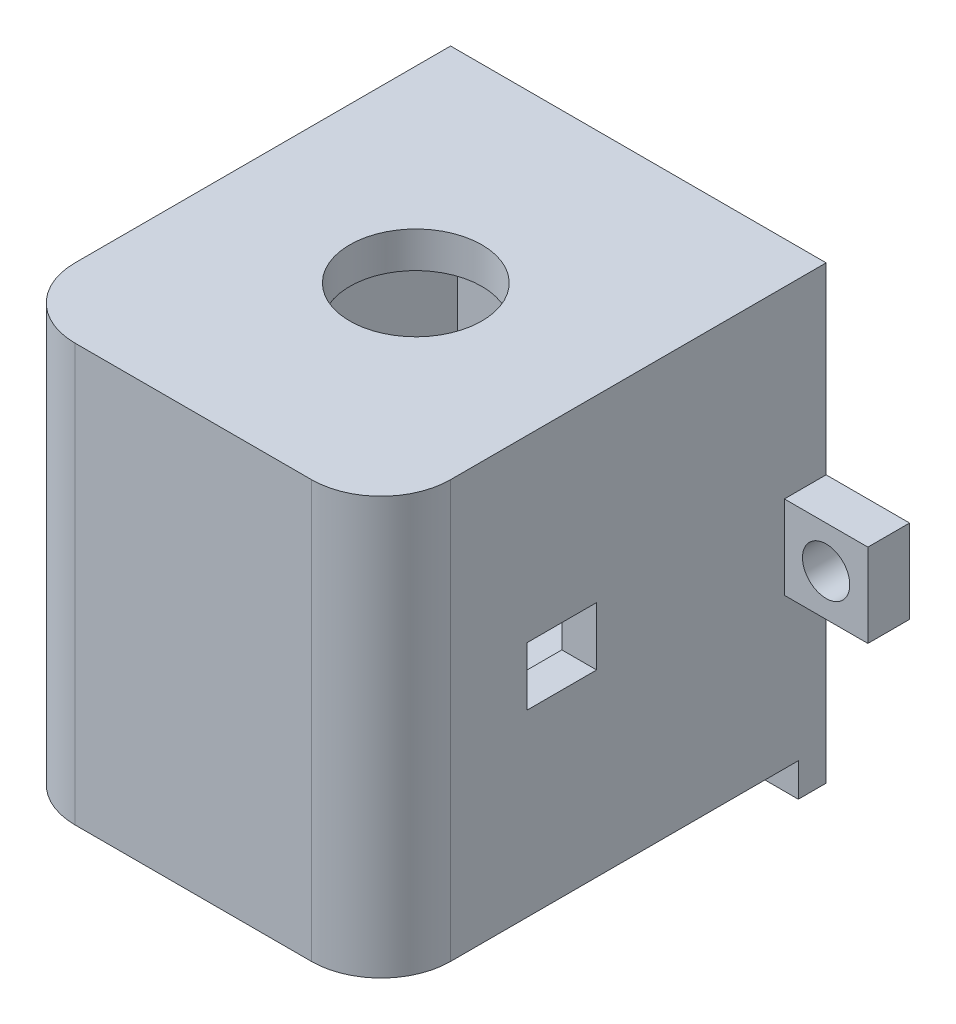
ISO-10303-21;
HEADER;
FILE_DESCRIPTION(('STEP AP214'),'2;1');
FILE_NAME('part.step','',(''),(''),'','','');
FILE_SCHEMA(('AUTOMOTIVE_DESIGN { 1 0 10303 214 1 1 1 1 }'));
ENDSEC;
DATA;
#1=APPLICATION_CONTEXT('core data for automotive mechanical design processes');
#2=APPLICATION_PROTOCOL_DEFINITION('international standard','automotive_design',2000,#1);
#3=PRODUCT_CONTEXT('',#1,'mechanical');
#4=PRODUCT('Part','Part','',(#3));
#5=PRODUCT_RELATED_PRODUCT_CATEGORY('part','',(#4));
#6=PRODUCT_DEFINITION_FORMATION('','',#4);
#7=PRODUCT_DEFINITION_CONTEXT('part definition',#1,'design');
#8=PRODUCT_DEFINITION('design','',#6,#7);
#9=PRODUCT_DEFINITION_SHAPE('','',#8);
#10=(LENGTH_UNIT() NAMED_UNIT(*) SI_UNIT(.MILLI.,.METRE.));
#11=(NAMED_UNIT(*) PLANE_ANGLE_UNIT() SI_UNIT($,.RADIAN.));
#12=(NAMED_UNIT(*) SI_UNIT($,.STERADIAN.) SOLID_ANGLE_UNIT());
#13=UNCERTAINTY_MEASURE_WITH_UNIT(LENGTH_MEASURE(1.E-05),#10,'distance_accuracy_value','');
#14=(GEOMETRIC_REPRESENTATION_CONTEXT(3) GLOBAL_UNCERTAINTY_ASSIGNED_CONTEXT((#13)) GLOBAL_UNIT_ASSIGNED_CONTEXT((#10,
#11,#12)) REPRESENTATION_CONTEXT('',''));
#15=CARTESIAN_POINT('',(0.,0.,0.));
#16=DIRECTION('',(0.,0.,1.));
#17=DIRECTION('',(1.,0.,0.));
#18=AXIS2_PLACEMENT_3D('',#15,#16,#17);
#19=CARTESIAN_POINT('',(-13.5,-13.8,28.));
#20=DIRECTION('',(1.,0.,0.));
#21=DIRECTION('',(0.,0.,-1.));
#22=AXIS2_PLACEMENT_3D('',#19,#20,#21);
#23=PLANE('',#22);
#24=CARTESIAN_POINT('',(-13.5,1.19999999999999,17.));
#25=DIRECTION('',(1.,0.,0.));
#26=DIRECTION('',(0.,0.,-1.));
#27=AXIS2_PLACEMENT_3D('',#24,#25,#26);
#28=CIRCLE('',#27,2.5);
#29=CARTESIAN_POINT('',(-13.5,1.19999999999999,14.5));
#30=VERTEX_POINT('',#29);
#31=EDGE_CURVE('E345',#30,#30,#28,.T.);
#32=ORIENTED_EDGE('',*,*,#31,.T.);
#33=EDGE_LOOP('',(#32));
#34=FACE_BOUND('',#33,.T.);
#35=DIRECTION('',(0.,0.,-1.));
#36=VECTOR('',#35,1.);
#37=CARTESIAN_POINT('',(-13.5,-13.8,28.));
#38=LINE('',#37,#36);
#39=CARTESIAN_POINT('',(-13.5,-13.8,25.));
#40=VERTEX_POINT('',#39);
#41=CARTESIAN_POINT('',(-13.5,-13.8,0.));
#42=VERTEX_POINT('',#41);
#43=EDGE_CURVE('E390',#40,#42,#38,.T.);
#44=ORIENTED_EDGE('',*,*,#43,.F.);
#45=DIRECTION('',(0.,-1.,0.));
#46=VECTOR('',#45,1.);
#47=CARTESIAN_POINT('',(-13.5,16.2,25.));
#48=LINE('',#47,#46);
#49=CARTESIAN_POINT('',(-13.5,16.2,25.));
#50=VERTEX_POINT('',#49);
#51=EDGE_CURVE('E11',#40,#50,#48,.F.);
#52=ORIENTED_EDGE('',*,*,#51,.T.);
#53=DIRECTION('',(0.,0.,-1.));
#54=VECTOR('',#53,1.);
#55=CARTESIAN_POINT('',(-13.5,16.2,28.));
#56=LINE('',#55,#54);
#57=CARTESIAN_POINT('',(-13.5,16.2,-2.));
#58=VERTEX_POINT('',#57);
#59=EDGE_CURVE('E384',#50,#58,#56,.T.);
#60=ORIENTED_EDGE('',*,*,#59,.T.);
#61=DIRECTION('',(0.,1.,0.));
#62=VECTOR('',#61,1.);
#63=CARTESIAN_POINT('',(-13.5,-16.2,-2.));
#64=LINE('',#63,#62);
#65=CARTESIAN_POINT('',(-13.5,3.,-2.));
#66=VERTEX_POINT('',#65);
#67=EDGE_CURVE('E287',#66,#58,#64,.T.);
#68=ORIENTED_EDGE('',*,*,#67,.F.);
#69=DIRECTION('',(0.,0.,-1.));
#70=VECTOR('',#69,1.);
#71=CARTESIAN_POINT('',(-13.5,3.,1.));
#72=LINE('',#71,#70);
#73=CARTESIAN_POINT('',(-13.5,3.,1.));
#74=VERTEX_POINT('',#73);
#75=EDGE_CURVE('E225',#74,#66,#72,.T.);
#76=ORIENTED_EDGE('',*,*,#75,.F.);
#77=DIRECTION('',(0.,1.,0.));
#78=VECTOR('',#77,1.);
#79=CARTESIAN_POINT('',(-13.5,-3.,1.));
#80=LINE('',#79,#78);
#81=CARTESIAN_POINT('',(-13.5,-3.,1.));
#82=VERTEX_POINT('',#81);
#83=EDGE_CURVE('E204',#82,#74,#80,.T.);
#84=ORIENTED_EDGE('',*,*,#83,.F.);
#85=DIRECTION('',(0.,0.,-1.));
#86=VECTOR('',#85,1.);
#87=CARTESIAN_POINT('',(-13.5,-3.,1.));
#88=LINE('',#87,#86);
#89=CARTESIAN_POINT('',(-13.5,-3.,-2.));
#90=VERTEX_POINT('',#89);
#91=EDGE_CURVE('E213',#82,#90,#88,.T.);
#92=ORIENTED_EDGE('',*,*,#91,.T.);
#93=CARTESIAN_POINT('',(-13.5,-16.2,-2.));
#94=VERTEX_POINT('',#93);
#95=EDGE_CURVE('E288',#94,#90,#64,.T.);
#96=ORIENTED_EDGE('',*,*,#95,.F.);
#97=DIRECTION('',(0.,0.,1.));
#98=VECTOR('',#97,1.);
#99=CARTESIAN_POINT('',(-13.5,-16.2,-2.));
#100=LINE('',#99,#98);
#101=CARTESIAN_POINT('',(-13.5,-16.2,0.));
#102=VERTEX_POINT('',#101);
#103=EDGE_CURVE('E293',#94,#102,#100,.T.);
#104=ORIENTED_EDGE('',*,*,#103,.T.);
#105=DIRECTION('',(0.,1.,0.));
#106=VECTOR('',#105,1.);
#107=CARTESIAN_POINT('',(-13.5,-16.2,0.));
#108=LINE('',#107,#106);
#109=EDGE_CURVE('E297',#102,#42,#108,.T.);
#110=ORIENTED_EDGE('',*,*,#109,.T.);
#111=EDGE_LOOP('',(#44,#52,#60,#68,#76,#84,#92,#96,#104,#110));
#112=FACE_BOUND('',#111,.T.);
#113=ADVANCED_FACE('F39',(#34,#112),#23,.F.);
#114=CARTESIAN_POINT('',(13.5,-13.8,28.));
#115=DIRECTION('',(-1.,0.,0.));
#116=DIRECTION('',(0.,0.,1.));
#117=AXIS2_PLACEMENT_3D('',#114,#115,#116);
#118=PLANE('',#117);
#119=DIRECTION('',(0.,0.,1.));
#120=VECTOR('',#119,1.);
#121=CARTESIAN_POINT('',(13.5,-0.900000000000007,28.));
#122=LINE('',#121,#120);
#123=CARTESIAN_POINT('',(13.5,-0.900000000000004,14.5));
#124=VERTEX_POINT('',#123);
#125=CARTESIAN_POINT('',(13.5,-0.900000000000006,19.5));
#126=VERTEX_POINT('',#125);
#127=EDGE_CURVE('E325',#124,#126,#122,.T.);
#128=ORIENTED_EDGE('',*,*,#127,.T.);
#129=DIRECTION('',(0.,1.,0.));
#130=VECTOR('',#129,1.);
#131=CARTESIAN_POINT('',(13.5,-13.8,19.5));
#132=LINE('',#131,#130);
#133=CARTESIAN_POINT('',(13.5,3.3,19.5));
#134=VERTEX_POINT('',#133);
#135=EDGE_CURVE('E341',#126,#134,#132,.T.);
#136=ORIENTED_EDGE('',*,*,#135,.T.);
#137=DIRECTION('',(0.,0.,-1.));
#138=VECTOR('',#137,1.);
#139=CARTESIAN_POINT('',(13.5,3.29999999999999,28.));
#140=LINE('',#139,#138);
#141=CARTESIAN_POINT('',(13.5,3.3,14.5));
#142=VERTEX_POINT('',#141);
#143=EDGE_CURVE('E338',#134,#142,#140,.T.);
#144=ORIENTED_EDGE('',*,*,#143,.T.);
#145=DIRECTION('',(0.,-1.,0.));
#146=VECTOR('',#145,1.);
#147=CARTESIAN_POINT('',(13.5,-13.8,14.5));
#148=LINE('',#147,#146);
#149=EDGE_CURVE('E335',#142,#124,#148,.T.);
#150=ORIENTED_EDGE('',*,*,#149,.T.);
#151=EDGE_LOOP('',(#128,#136,#144,#150));
#152=FACE_BOUND('',#151,.T.);
#153=DIRECTION('',(0.,0.,-1.));
#154=VECTOR('',#153,1.);
#155=CARTESIAN_POINT('',(13.5,16.2,28.));
#156=LINE('',#155,#154);
#157=CARTESIAN_POINT('',(13.5,16.2,25.));
#158=VERTEX_POINT('',#157);
#159=CARTESIAN_POINT('',(13.5,16.2,-2.));
#160=VERTEX_POINT('',#159);
#161=EDGE_CURVE('E386',#158,#160,#156,.T.);
#162=ORIENTED_EDGE('',*,*,#161,.F.);
#163=DIRECTION('',(0.,1.,0.));
#164=VECTOR('',#163,1.);
#165=CARTESIAN_POINT('',(13.5,-13.8,25.));
#166=LINE('',#165,#164);
#167=CARTESIAN_POINT('',(13.5,-13.8,25.));
#168=VERTEX_POINT('',#167);
#169=EDGE_CURVE('E62',#158,#168,#166,.F.);
#170=ORIENTED_EDGE('',*,*,#169,.T.);
#171=DIRECTION('',(0.,0.,-1.));
#172=VECTOR('',#171,1.);
#173=CARTESIAN_POINT('',(13.5,-13.8,28.));
#174=LINE('',#173,#172);
#175=CARTESIAN_POINT('',(13.5,-13.8,0.));
#176=VERTEX_POINT('',#175);
#177=EDGE_CURVE('E388',#168,#176,#174,.T.);
#178=ORIENTED_EDGE('',*,*,#177,.T.);
#179=DIRECTION('',(0.,-1.,0.));
#180=VECTOR('',#179,1.);
#181=CARTESIAN_POINT('',(13.5,-16.2,0.));
#182=LINE('',#181,#180);
#183=CARTESIAN_POINT('',(13.5,-16.2,0.));
#184=VERTEX_POINT('',#183);
#185=EDGE_CURVE('E274',#176,#184,#182,.T.);
#186=ORIENTED_EDGE('',*,*,#185,.T.);
#187=DIRECTION('',(0.,0.,1.));
#188=VECTOR('',#187,1.);
#189=CARTESIAN_POINT('',(13.5,-16.2,-2.));
#190=LINE('',#189,#188);
#191=CARTESIAN_POINT('',(13.5,-16.2,-2.));
#192=VERTEX_POINT('',#191);
#193=EDGE_CURVE('E302',#192,#184,#190,.T.);
#194=ORIENTED_EDGE('',*,*,#193,.F.);
#195=DIRECTION('',(0.,-1.,0.));
#196=VECTOR('',#195,1.);
#197=CARTESIAN_POINT('',(13.5,-16.2,-2.));
#198=LINE('',#197,#196);
#199=CARTESIAN_POINT('',(13.5,-3.,-2.));
#200=VERTEX_POINT('',#199);
#201=EDGE_CURVE('E285',#200,#192,#198,.T.);
#202=ORIENTED_EDGE('',*,*,#201,.F.);
#203=DIRECTION('',(0.,0.,-1.));
#204=VECTOR('',#203,1.);
#205=CARTESIAN_POINT('',(13.5,-3.,1.));
#206=LINE('',#205,#204);
#207=CARTESIAN_POINT('',(13.5,-3.,1.));
#208=VERTEX_POINT('',#207);
#209=EDGE_CURVE('E272',#208,#200,#206,.T.);
#210=ORIENTED_EDGE('',*,*,#209,.F.);
#211=DIRECTION('',(0.,1.,0.));
#212=VECTOR('',#211,1.);
#213=CARTESIAN_POINT('',(13.5,-3.,1.));
#214=LINE('',#213,#212);
#215=CARTESIAN_POINT('',(13.5,3.,1.));
#216=VERTEX_POINT('',#215);
#217=EDGE_CURVE('E251',#208,#216,#214,.T.);
#218=ORIENTED_EDGE('',*,*,#217,.T.);
#219=DIRECTION('',(0.,0.,-1.));
#220=VECTOR('',#219,1.);
#221=CARTESIAN_POINT('',(13.5,3.,1.));
#222=LINE('',#221,#220);
#223=CARTESIAN_POINT('',(13.5,3.,-2.));
#224=VERTEX_POINT('',#223);
#225=EDGE_CURVE('E264',#216,#224,#222,.T.);
#226=ORIENTED_EDGE('',*,*,#225,.T.);
#227=EDGE_CURVE('E281',#160,#224,#198,.T.);
#228=ORIENTED_EDGE('',*,*,#227,.F.);
#229=EDGE_LOOP('',(#162,#170,#178,#186,#194,#202,#210,#218,#226,#228));
#230=FACE_BOUND('',#229,.T.);
#231=ADVANCED_FACE('F429',(#152,#230),#118,.F.);
#232=CARTESIAN_POINT('',(13.5,-13.8,28.));
#233=DIRECTION('',(0.,1.,0.));
#234=DIRECTION('',(-1.,0.,0.));
#235=AXIS2_PLACEMENT_3D('',#232,#233,#234);
#236=PLANE('',#235);
#237=CARTESIAN_POINT('',(0.,-13.8,14.));
#238=DIRECTION('',(0.,-1.,0.));
#239=DIRECTION('',(0.,0.,-1.));
#240=AXIS2_PLACEMENT_3D('',#237,#238,#239);
#241=CIRCLE('',#240,4.75);
#242=CARTESIAN_POINT('',(0.,-13.8,9.25));
#243=VERTEX_POINT('',#242);
#244=EDGE_CURVE('E311',#243,#243,#241,.T.);
#245=ORIENTED_EDGE('',*,*,#244,.F.);
#246=EDGE_LOOP('',(#245));
#247=FACE_BOUND('',#246,.T.);
#248=ORIENTED_EDGE('',*,*,#177,.F.);
#249=CARTESIAN_POINT('',(8.5,-13.8,25.));
#250=DIRECTION('',(0.,1.,0.));
#251=DIRECTION('',(-1.,0.,0.));
#252=AXIS2_PLACEMENT_3D('',#249,#250,#251);
#253=CIRCLE('',#252,5.);
#254=CARTESIAN_POINT('',(8.5,-13.8,30.));
#255=VERTEX_POINT('',#254);
#256=EDGE_CURVE('E47',#168,#255,#253,.F.);
#257=ORIENTED_EDGE('',*,*,#256,.T.);
#258=DIRECTION('',(1.,0.,0.));
#259=VECTOR('',#258,1.);
#260=CARTESIAN_POINT('',(13.5,-13.8,30.));
#261=LINE('',#260,#259);
#262=CARTESIAN_POINT('',(-8.49999999999999,-13.8,30.));
#263=VERTEX_POINT('',#262);
#264=EDGE_CURVE('E305',#263,#255,#261,.T.);
#265=ORIENTED_EDGE('',*,*,#264,.F.);
#266=CARTESIAN_POINT('',(-8.5,-13.8,25.));
#267=DIRECTION('',(0.,1.,0.));
#268=DIRECTION('',(-1.,0.,0.));
#269=AXIS2_PLACEMENT_3D('',#266,#267,#268);
#270=CIRCLE('',#269,5.);
#271=EDGE_CURVE('E54',#263,#40,#270,.F.);
#272=ORIENTED_EDGE('',*,*,#271,.T.);
#273=ORIENTED_EDGE('',*,*,#43,.T.);
#274=DIRECTION('',(1.,0.,0.));
#275=VECTOR('',#274,1.);
#276=CARTESIAN_POINT('',(13.5,-13.8,0.));
#277=LINE('',#276,#275);
#278=EDGE_CURVE('E381',#42,#176,#277,.T.);
#279=ORIENTED_EDGE('',*,*,#278,.T.);
#280=EDGE_LOOP('',(#248,#257,#265,#272,#273,#279));
#281=FACE_BOUND('',#280,.T.);
#282=ADVANCED_FACE('F417',(#247,#281),#236,.F.);
#283=CARTESIAN_POINT('',(13.5,16.2,28.));
#284=DIRECTION('',(0.,-1.,0.));
#285=DIRECTION('',(0.,0.,-1.));
#286=AXIS2_PLACEMENT_3D('',#283,#284,#285);
#287=PLANE('',#286);
#288=CARTESIAN_POINT('',(0.,16.2,14.));
#289=DIRECTION('',(0.,-1.,0.));
#290=DIRECTION('',(0.,0.,-1.));
#291=AXIS2_PLACEMENT_3D('',#288,#289,#290);
#292=CIRCLE('',#291,4.75);
#293=CARTESIAN_POINT('',(0.,16.2,9.25));
#294=VERTEX_POINT('',#293);
#295=EDGE_CURVE('E318',#294,#294,#292,.T.);
#296=ORIENTED_EDGE('',*,*,#295,.T.);
#297=EDGE_LOOP('',(#296));
#298=FACE_BOUND('',#297,.T.);
#299=DIRECTION('',(-1.,0.,0.));
#300=VECTOR('',#299,1.);
#301=CARTESIAN_POINT('',(13.5,16.2,30.));
#302=LINE('',#301,#300);
#303=CARTESIAN_POINT('',(8.5,16.2,30.));
#304=VERTEX_POINT('',#303);
#305=CARTESIAN_POINT('',(-8.49999999999999,16.2,30.));
#306=VERTEX_POINT('',#305);
#307=EDGE_CURVE('E308',#304,#306,#302,.T.);
#308=ORIENTED_EDGE('',*,*,#307,.F.);
#309=CARTESIAN_POINT('',(8.5,16.2,25.));
#310=DIRECTION('',(0.,-1.,0.));
#311=DIRECTION('',(0.,0.,-1.));
#312=AXIS2_PLACEMENT_3D('',#309,#310,#311);
#313=CIRCLE('',#312,5.);
#314=EDGE_CURVE('E413',#304,#158,#313,.F.);
#315=ORIENTED_EDGE('',*,*,#314,.T.);
#316=ORIENTED_EDGE('',*,*,#161,.T.);
#317=DIRECTION('',(1.,0.,0.));
#318=VECTOR('',#317,1.);
#319=CARTESIAN_POINT('',(-13.5,16.2,-2.));
#320=LINE('',#319,#318);
#321=EDGE_CURVE('E290',#58,#160,#320,.T.);
#322=ORIENTED_EDGE('',*,*,#321,.F.);
#323=ORIENTED_EDGE('',*,*,#59,.F.);
#324=CARTESIAN_POINT('',(-8.5,16.2,25.));
#325=DIRECTION('',(0.,-1.,0.));
#326=DIRECTION('',(0.,0.,-1.));
#327=AXIS2_PLACEMENT_3D('',#324,#325,#326);
#328=CIRCLE('',#327,5.);
#329=EDGE_CURVE('E411',#50,#306,#328,.F.);
#330=ORIENTED_EDGE('',*,*,#329,.T.);
#331=EDGE_LOOP('',(#308,#315,#316,#322,#323,#330));
#332=FACE_BOUND('',#331,.T.);
#333=ADVANCED_FACE('F426',(#298,#332),#287,.F.);
#334=CARTESIAN_POINT('',(-11.,-11.3914969736936,28.));
#335=DIRECTION('',(1.,0.,0.));
#336=DIRECTION('',(0.,0.,-1.));
#337=AXIS2_PLACEMENT_3D('',#334,#335,#336);
#338=PLANE('',#337);
#339=CARTESIAN_POINT('',(-11.,1.19999999999999,17.));
#340=DIRECTION('',(1.,0.,0.));
#341=DIRECTION('',(0.,0.,-1.));
#342=AXIS2_PLACEMENT_3D('',#339,#340,#341);
#343=CIRCLE('',#342,2.5);
#344=CARTESIAN_POINT('',(-11.,1.19999999999999,14.5));
#345=VERTEX_POINT('',#344);
#346=EDGE_CURVE('E344',#345,#345,#343,.T.);
#347=ORIENTED_EDGE('',*,*,#346,.F.);
#348=EDGE_LOOP('',(#347));
#349=FACE_BOUND('',#348,.T.);
#350=DIRECTION('',(0.,-1.,0.));
#351=VECTOR('',#350,1.);
#352=CARTESIAN_POINT('',(-11.,-11.3914969736936,0.));
#353=LINE('',#352,#351);
#354=CARTESIAN_POINT('',(-11.,13.6085030263064,0.));
#355=VERTEX_POINT('',#354);
#356=CARTESIAN_POINT('',(-11.,-11.3914969736936,0.));
#357=VERTEX_POINT('',#356);
#358=EDGE_CURVE('E348',#355,#357,#353,.T.);
#359=ORIENTED_EDGE('',*,*,#358,.F.);
#360=DIRECTION('',(0.,0.,-1.));
#361=VECTOR('',#360,1.);
#362=CARTESIAN_POINT('',(-11.,13.6085030263064,28.));
#363=LINE('',#362,#361);
#364=CARTESIAN_POINT('',(-11.,13.6085030263064,28.));
#365=VERTEX_POINT('',#364);
#366=EDGE_CURVE('E362',#365,#355,#363,.T.);
#367=ORIENTED_EDGE('',*,*,#366,.F.);
#368=DIRECTION('',(0.,-1.,0.));
#369=VECTOR('',#368,1.);
#370=CARTESIAN_POINT('',(-11.,-11.3914969736936,28.));
#371=LINE('',#370,#369);
#372=CARTESIAN_POINT('',(-11.,-11.3914969736936,28.));
#373=VERTEX_POINT('',#372);
#374=EDGE_CURVE('E349',#365,#373,#371,.T.);
#375=ORIENTED_EDGE('',*,*,#374,.T.);
#376=DIRECTION('',(0.,0.,-1.));
#377=VECTOR('',#376,1.);
#378=CARTESIAN_POINT('',(-11.,-11.3914969736936,28.));
#379=LINE('',#378,#377);
#380=EDGE_CURVE('E378',#373,#357,#379,.T.);
#381=ORIENTED_EDGE('',*,*,#380,.T.);
#382=EDGE_LOOP('',(#359,#367,#375,#381));
#383=FACE_BOUND('',#382,.T.);
#384=ADVANCED_FACE('F571',(#349,#383),#338,.T.);
#385=CARTESIAN_POINT('',(11.,-11.3914969736936,28.));
#386=DIRECTION('',(0.,1.,0.));
#387=DIRECTION('',(-1.,0.,0.));
#388=AXIS2_PLACEMENT_3D('',#385,#386,#387);
#389=PLANE('',#388);
#390=CARTESIAN_POINT('',(0.,-11.3914969736936,14.));
#391=DIRECTION('',(0.,1.,0.));
#392=DIRECTION('',(-1.,0.,0.));
#393=AXIS2_PLACEMENT_3D('',#390,#391,#392);
#394=CIRCLE('',#393,4.75);
#395=CARTESIAN_POINT('',(-4.74999999999999,-11.3914969736936,14.));
#396=VERTEX_POINT('',#395);
#397=EDGE_CURVE('E315',#396,#396,#394,.T.);
#398=ORIENTED_EDGE('',*,*,#397,.F.);
#399=EDGE_LOOP('',(#398));
#400=FACE_BOUND('',#399,.T.);
#401=DIRECTION('',(1.,0.,0.));
#402=VECTOR('',#401,1.);
#403=CARTESIAN_POINT('',(11.,-11.3914969736936,0.));
#404=LINE('',#403,#402);
#405=CARTESIAN_POINT('',(11.,-11.3914969736936,0.));
#406=VERTEX_POINT('',#405);
#407=EDGE_CURVE('E365',#357,#406,#404,.T.);
#408=ORIENTED_EDGE('',*,*,#407,.F.);
#409=ORIENTED_EDGE('',*,*,#380,.F.);
#410=DIRECTION('',(1.,0.,0.));
#411=VECTOR('',#410,1.);
#412=CARTESIAN_POINT('',(11.,-11.3914969736936,28.));
#413=LINE('',#412,#411);
#414=CARTESIAN_POINT('',(11.,-11.3914969736936,28.));
#415=VERTEX_POINT('',#414);
#416=EDGE_CURVE('E352',#373,#415,#413,.T.);
#417=ORIENTED_EDGE('',*,*,#416,.T.);
#418=DIRECTION('',(0.,0.,-1.));
#419=VECTOR('',#418,1.);
#420=CARTESIAN_POINT('',(11.,-11.3914969736936,28.));
#421=LINE('',#420,#419);
#422=EDGE_CURVE('E376',#415,#406,#421,.T.);
#423=ORIENTED_EDGE('',*,*,#422,.T.);
#424=EDGE_LOOP('',(#408,#409,#417,#423));
#425=FACE_BOUND('',#424,.T.);
#426=ADVANCED_FACE('F567',(#400,#425),#389,.T.);
#427=CARTESIAN_POINT('',(11.,-11.3914969736936,28.));
#428=DIRECTION('',(-1.,0.,0.));
#429=DIRECTION('',(0.,0.,1.));
#430=AXIS2_PLACEMENT_3D('',#427,#428,#429);
#431=PLANE('',#430);
#432=DIRECTION('',(0.,1.,0.));
#433=VECTOR('',#432,1.);
#434=CARTESIAN_POINT('',(11.,-11.3914969736936,19.5));
#435=LINE('',#434,#433);
#436=CARTESIAN_POINT('',(11.,-0.900000000000005,19.5));
#437=VERTEX_POINT('',#436);
#438=CARTESIAN_POINT('',(11.,3.3,19.5));
#439=VERTEX_POINT('',#438);
#440=EDGE_CURVE('E401',#437,#439,#435,.T.);
#441=ORIENTED_EDGE('',*,*,#440,.F.);
#442=DIRECTION('',(0.,0.,1.));
#443=VECTOR('',#442,1.);
#444=CARTESIAN_POINT('',(11.,-0.900000000000007,28.));
#445=LINE('',#444,#443);
#446=CARTESIAN_POINT('',(11.,-0.900000000000005,14.5));
#447=VERTEX_POINT('',#446);
#448=EDGE_CURVE('E392',#447,#437,#445,.T.);
#449=ORIENTED_EDGE('',*,*,#448,.F.);
#450=DIRECTION('',(0.,-1.,0.));
#451=VECTOR('',#450,1.);
#452=CARTESIAN_POINT('',(11.,-11.3914969736936,14.5));
#453=LINE('',#452,#451);
#454=CARTESIAN_POINT('',(11.,3.3,14.5));
#455=VERTEX_POINT('',#454);
#456=EDGE_CURVE('E396',#455,#447,#453,.T.);
#457=ORIENTED_EDGE('',*,*,#456,.F.);
#458=DIRECTION('',(0.,0.,-1.));
#459=VECTOR('',#458,1.);
#460=CARTESIAN_POINT('',(11.,3.3,28.));
#461=LINE('',#460,#459);
#462=EDGE_CURVE('E399',#439,#455,#461,.T.);
#463=ORIENTED_EDGE('',*,*,#462,.F.);
#464=EDGE_LOOP('',(#441,#449,#457,#463));
#465=FACE_BOUND('',#464,.T.);
#466=DIRECTION('',(0.,1.,0.));
#467=VECTOR('',#466,1.);
#468=CARTESIAN_POINT('',(11.,-11.3914969736936,0.));
#469=LINE('',#468,#467);
#470=CARTESIAN_POINT('',(11.,13.6085030263064,0.));
#471=VERTEX_POINT('',#470);
#472=EDGE_CURVE('E368',#406,#471,#469,.T.);
#473=ORIENTED_EDGE('',*,*,#472,.F.);
#474=ORIENTED_EDGE('',*,*,#422,.F.);
#475=DIRECTION('',(0.,1.,0.));
#476=VECTOR('',#475,1.);
#477=CARTESIAN_POINT('',(11.,-11.3914969736936,28.));
#478=LINE('',#477,#476);
#479=CARTESIAN_POINT('',(11.,13.6085030263064,28.));
#480=VERTEX_POINT('',#479);
#481=EDGE_CURVE('E356',#415,#480,#478,.T.);
#482=ORIENTED_EDGE('',*,*,#481,.T.);
#483=DIRECTION('',(0.,0.,-1.));
#484=VECTOR('',#483,1.);
#485=CARTESIAN_POINT('',(11.,13.6085030263064,28.));
#486=LINE('',#485,#484);
#487=EDGE_CURVE('E374',#480,#471,#486,.T.);
#488=ORIENTED_EDGE('',*,*,#487,.T.);
#489=EDGE_LOOP('',(#473,#474,#482,#488));
#490=FACE_BOUND('',#489,.T.);
#491=ADVANCED_FACE('F563',(#465,#490),#431,.T.);
#492=CARTESIAN_POINT('',(11.,13.6085030263064,28.));
#493=DIRECTION('',(0.,-1.,0.));
#494=DIRECTION('',(1.,0.,0.));
#495=AXIS2_PLACEMENT_3D('',#492,#493,#494);
#496=PLANE('',#495);
#497=CARTESIAN_POINT('',(0.,13.6085030263064,14.));
#498=DIRECTION('',(0.,-1.,0.));
#499=DIRECTION('',(1.,0.,0.));
#500=AXIS2_PLACEMENT_3D('',#497,#498,#499);
#501=CIRCLE('',#500,4.75);
#502=CARTESIAN_POINT('',(4.75000000000001,13.6085030263064,14.));
#503=VERTEX_POINT('',#502);
#504=EDGE_CURVE('E314',#503,#503,#501,.T.);
#505=ORIENTED_EDGE('',*,*,#504,.F.);
#506=EDGE_LOOP('',(#505));
#507=FACE_BOUND('',#506,.T.);
#508=DIRECTION('',(-1.,0.,0.));
#509=VECTOR('',#508,1.);
#510=CARTESIAN_POINT('',(11.,13.6085030263064,0.));
#511=LINE('',#510,#509);
#512=EDGE_CURVE('E353',#471,#355,#511,.T.);
#513=ORIENTED_EDGE('',*,*,#512,.F.);
#514=ORIENTED_EDGE('',*,*,#487,.F.);
#515=DIRECTION('',(-1.,0.,0.));
#516=VECTOR('',#515,1.);
#517=CARTESIAN_POINT('',(11.,13.6085030263064,28.));
#518=LINE('',#517,#516);
#519=EDGE_CURVE('E359',#480,#365,#518,.T.);
#520=ORIENTED_EDGE('',*,*,#519,.T.);
#521=ORIENTED_EDGE('',*,*,#366,.T.);
#522=EDGE_LOOP('',(#513,#514,#520,#521));
#523=FACE_BOUND('',#522,.T.);
#524=ADVANCED_FACE('F559',(#507,#523),#496,.T.);
#525=CARTESIAN_POINT('',(0.500000000000004,1.19999999999999,17.));
#526=DIRECTION('',(-1.,0.,0.));
#527=DIRECTION('',(0.,0.,1.));
#528=AXIS2_PLACEMENT_3D('',#525,#526,#527);
#529=CYLINDRICAL_SURFACE('',#528,2.5);
#530=ORIENTED_EDGE('',*,*,#346,.T.);
#531=EDGE_LOOP('',(#530));
#532=FACE_BOUND('',#531,.T.);
#533=ORIENTED_EDGE('',*,*,#31,.F.);
#534=EDGE_LOOP('',(#533));
#535=FACE_BOUND('',#534,.T.);
#536=ADVANCED_FACE('F555',(#532,#535),#529,.F.);
#537=CARTESIAN_POINT('',(-0.499999999999997,-0.900000000000005,19.5));
#538=DIRECTION('',(0.,0.,1.));
#539=DIRECTION('',(1.,0.,0.));
#540=AXIS2_PLACEMENT_3D('',#537,#538,#539);
#541=PLANE('',#540);
#542=DIRECTION('',(1.,0.,0.));
#543=VECTOR('',#542,1.);
#544=CARTESIAN_POINT('',(-0.499999999999997,-0.900000000000005,19.5));
#545=LINE('',#544,#543);
#546=EDGE_CURVE('E321',#437,#126,#545,.T.);
#547=ORIENTED_EDGE('',*,*,#546,.F.);
#548=ORIENTED_EDGE('',*,*,#440,.T.);
#549=DIRECTION('',(1.,0.,0.));
#550=VECTOR('',#549,1.);
#551=CARTESIAN_POINT('',(-0.499999999999997,3.3,19.5));
#552=LINE('',#551,#550);
#553=EDGE_CURVE('E322',#439,#134,#552,.T.);
#554=ORIENTED_EDGE('',*,*,#553,.T.);
#555=ORIENTED_EDGE('',*,*,#135,.F.);
#556=EDGE_LOOP('',(#547,#548,#554,#555));
#557=FACE_BOUND('',#556,.T.);
#558=ADVANCED_FACE('F545',(#557),#541,.F.);
#559=CARTESIAN_POINT('',(-0.499999999999997,3.3,14.5));
#560=DIRECTION('',(0.,1.,0.));
#561=DIRECTION('',(0.,0.,1.));
#562=AXIS2_PLACEMENT_3D('',#559,#560,#561);
#563=PLANE('',#562);
#564=ORIENTED_EDGE('',*,*,#553,.F.);
#565=ORIENTED_EDGE('',*,*,#462,.T.);
#566=DIRECTION('',(1.,0.,0.));
#567=VECTOR('',#566,1.);
#568=CARTESIAN_POINT('',(-0.499999999999997,3.3,14.5));
#569=LINE('',#568,#567);
#570=EDGE_CURVE('E326',#455,#142,#569,.T.);
#571=ORIENTED_EDGE('',*,*,#570,.T.);
#572=ORIENTED_EDGE('',*,*,#143,.F.);
#573=EDGE_LOOP('',(#564,#565,#571,#572));
#574=FACE_BOUND('',#573,.T.);
#575=ADVANCED_FACE('F541',(#574),#563,.F.);
#576=CARTESIAN_POINT('',(-0.499999999999997,-0.900000000000004,14.5));
#577=DIRECTION('',(0.,0.,-1.));
#578=DIRECTION('',(-1.,0.,0.));
#579=AXIS2_PLACEMENT_3D('',#576,#577,#578);
#580=PLANE('',#579);
#581=ORIENTED_EDGE('',*,*,#570,.F.);
#582=ORIENTED_EDGE('',*,*,#456,.T.);
#583=DIRECTION('',(1.,0.,0.));
#584=VECTOR('',#583,1.);
#585=CARTESIAN_POINT('',(-0.499999999999997,-0.900000000000004,14.5));
#586=LINE('',#585,#584);
#587=EDGE_CURVE('E329',#447,#124,#586,.T.);
#588=ORIENTED_EDGE('',*,*,#587,.T.);
#589=ORIENTED_EDGE('',*,*,#149,.F.);
#590=EDGE_LOOP('',(#581,#582,#588,#589));
#591=FACE_BOUND('',#590,.T.);
#592=ADVANCED_FACE('F544',(#591),#580,.F.);
#593=CARTESIAN_POINT('',(-0.499999999999997,-0.900000000000004,14.5));
#594=DIRECTION('',(0.,-1.,0.));
#595=DIRECTION('',(0.,0.,-1.));
#596=AXIS2_PLACEMENT_3D('',#593,#594,#595);
#597=PLANE('',#596);
#598=ORIENTED_EDGE('',*,*,#587,.F.);
#599=ORIENTED_EDGE('',*,*,#448,.T.);
#600=ORIENTED_EDGE('',*,*,#546,.T.);
#601=ORIENTED_EDGE('',*,*,#127,.F.);
#602=EDGE_LOOP('',(#598,#599,#600,#601));
#603=FACE_BOUND('',#602,.T.);
#604=ADVANCED_FACE('F539',(#603),#597,.F.);
#605=CARTESIAN_POINT('',(0.,44.2,14.));
#606=DIRECTION('',(0.,-1.,0.));
#607=DIRECTION('',(0.,0.,-1.));
#608=AXIS2_PLACEMENT_3D('',#605,#606,#607);
#609=CYLINDRICAL_SURFACE('',#608,4.75);
#610=ORIENTED_EDGE('',*,*,#504,.T.);
#611=EDGE_LOOP('',(#610));
#612=FACE_BOUND('',#611,.T.);
#613=ORIENTED_EDGE('',*,*,#295,.F.);
#614=EDGE_LOOP('',(#613));
#615=FACE_BOUND('',#614,.T.);
#616=ADVANCED_FACE('F536',(#612,#615),#609,.F.);
#617=ORIENTED_EDGE('',*,*,#397,.T.);
#618=EDGE_LOOP('',(#617));
#619=FACE_BOUND('',#618,.T.);
#620=ORIENTED_EDGE('',*,*,#244,.T.);
#621=EDGE_LOOP('',(#620));
#622=FACE_BOUND('',#621,.T.);
#623=ADVANCED_FACE('F534',(#619,#622),#609,.F.);
#624=CARTESIAN_POINT('',(0.,0.,28.));
#625=DIRECTION('',(0.,0.,1.));
#626=DIRECTION('',(1.,0.,0.));
#627=AXIS2_PLACEMENT_3D('',#624,#625,#626);
#628=PLANE('',#627);
#629=ORIENTED_EDGE('',*,*,#416,.F.);
#630=ORIENTED_EDGE('',*,*,#374,.F.);
#631=ORIENTED_EDGE('',*,*,#519,.F.);
#632=ORIENTED_EDGE('',*,*,#481,.F.);
#633=EDGE_LOOP('',(#629,#630,#631,#632));
#634=FACE_BOUND('',#633,.T.);
#635=ADVANCED_FACE('F531',(#634),#628,.F.);
#636=CARTESIAN_POINT('',(0.,0.,30.));
#637=DIRECTION('',(0.,0.,1.));
#638=DIRECTION('',(1.,0.,0.));
#639=AXIS2_PLACEMENT_3D('',#636,#637,#638);
#640=PLANE('',#639);
#641=ORIENTED_EDGE('',*,*,#264,.T.);
#642=DIRECTION('',(0.,1.,0.));
#643=VECTOR('',#642,1.);
#644=CARTESIAN_POINT('',(8.5,16.2,30.));
#645=LINE('',#644,#643);
#646=EDGE_CURVE('E408',#255,#304,#645,.T.);
#647=ORIENTED_EDGE('',*,*,#646,.T.);
#648=ORIENTED_EDGE('',*,*,#307,.T.);
#649=DIRECTION('',(0.,-1.,0.));
#650=VECTOR('',#649,1.);
#651=CARTESIAN_POINT('',(-8.5,-13.8,30.));
#652=LINE('',#651,#650);
#653=EDGE_CURVE('E403',#306,#263,#652,.T.);
#654=ORIENTED_EDGE('',*,*,#653,.T.);
#655=EDGE_LOOP('',(#641,#647,#648,#654));
#656=FACE_BOUND('',#655,.T.);
#657=ADVANCED_FACE('F421',(#656),#640,.T.);
#658=CARTESIAN_POINT('',(0.,0.,0.));
#659=DIRECTION('',(0.,0.,-1.));
#660=DIRECTION('',(-1.,0.,0.));
#661=AXIS2_PLACEMENT_3D('',#658,#659,#660);
#662=PLANE('',#661);
#663=ORIENTED_EDGE('',*,*,#512,.T.);
#664=ORIENTED_EDGE('',*,*,#358,.T.);
#665=ORIENTED_EDGE('',*,*,#407,.T.);
#666=ORIENTED_EDGE('',*,*,#472,.T.);
#667=EDGE_LOOP('',(#663,#664,#665,#666));
#668=FACE_BOUND('',#667,.T.);
#669=ADVANCED_FACE('F526',(#668),#662,.F.);
#670=CARTESIAN_POINT('',(-13.5,-16.2,-2.));
#671=DIRECTION('',(0.,1.,0.));
#672=DIRECTION('',(0.,0.,1.));
#673=AXIS2_PLACEMENT_3D('',#670,#671,#672);
#674=PLANE('',#673);
#675=DIRECTION('',(-1.,0.,0.));
#676=VECTOR('',#675,1.);
#677=CARTESIAN_POINT('',(-13.5,-16.2,0.));
#678=LINE('',#677,#676);
#679=EDGE_CURVE('E295',#184,#102,#678,.T.);
#680=ORIENTED_EDGE('',*,*,#679,.T.);
#681=ORIENTED_EDGE('',*,*,#103,.F.);
#682=DIRECTION('',(-1.,0.,0.));
#683=VECTOR('',#682,1.);
#684=CARTESIAN_POINT('',(-13.5,-16.2,-2.));
#685=LINE('',#684,#683);
#686=EDGE_CURVE('E284',#192,#94,#685,.T.);
#687=ORIENTED_EDGE('',*,*,#686,.F.);
#688=ORIENTED_EDGE('',*,*,#193,.T.);
#689=EDGE_LOOP('',(#680,#681,#687,#688));
#690=FACE_BOUND('',#689,.T.);
#691=ADVANCED_FACE('F450',(#690),#674,.F.);
#692=CARTESIAN_POINT('',(0.,0.,-2.));
#693=DIRECTION('',(0.,0.,-1.));
#694=DIRECTION('',(-1.,0.,0.));
#695=AXIS2_PLACEMENT_3D('',#692,#693,#694);
#696=PLANE('',#695);
#697=DIRECTION('',(-1.,0.,0.));
#698=VECTOR('',#697,1.);
#699=CARTESIAN_POINT('',(-13.5,3.,-2.));
#700=LINE('',#699,#698);
#701=CARTESIAN_POINT('',(-19.5,3.,-2.));
#702=VERTEX_POINT('',#701);
#703=EDGE_CURVE('E226',#66,#702,#700,.T.);
#704=ORIENTED_EDGE('',*,*,#703,.F.);
#705=ORIENTED_EDGE('',*,*,#67,.T.);
#706=ORIENTED_EDGE('',*,*,#321,.T.);
#707=ORIENTED_EDGE('',*,*,#227,.T.);
#708=DIRECTION('',(1.,0.,0.));
#709=VECTOR('',#708,1.);
#710=CARTESIAN_POINT('',(13.5,3.,-2.));
#711=LINE('',#710,#709);
#712=CARTESIAN_POINT('',(19.5,3.,-2.));
#713=VERTEX_POINT('',#712);
#714=EDGE_CURVE('E248',#224,#713,#711,.T.);
#715=ORIENTED_EDGE('',*,*,#714,.T.);
#716=DIRECTION('',(0.,-1.,0.));
#717=VECTOR('',#716,1.);
#718=CARTESIAN_POINT('',(19.5,3.,-2.));
#719=LINE('',#718,#717);
#720=CARTESIAN_POINT('',(19.5,-3.,-2.));
#721=VERTEX_POINT('',#720);
#722=EDGE_CURVE('E267',#713,#721,#719,.T.);
#723=ORIENTED_EDGE('',*,*,#722,.T.);
#724=DIRECTION('',(-1.,0.,0.));
#725=VECTOR('',#724,1.);
#726=CARTESIAN_POINT('',(19.5,-3.,-2.));
#727=LINE('',#726,#725);
#728=EDGE_CURVE('E255',#721,#200,#727,.T.);
#729=ORIENTED_EDGE('',*,*,#728,.T.);
#730=ORIENTED_EDGE('',*,*,#201,.T.);
#731=ORIENTED_EDGE('',*,*,#686,.T.);
#732=ORIENTED_EDGE('',*,*,#95,.T.);
#733=DIRECTION('',(1.,0.,0.));
#734=VECTOR('',#733,1.);
#735=CARTESIAN_POINT('',(-19.5,-3.,-2.));
#736=LINE('',#735,#734);
#737=CARTESIAN_POINT('',(-19.5,-3.,-2.));
#738=VERTEX_POINT('',#737);
#739=EDGE_CURVE('E216',#738,#90,#736,.T.);
#740=ORIENTED_EDGE('',*,*,#739,.F.);
#741=DIRECTION('',(0.,-1.,0.));
#742=VECTOR('',#741,1.);
#743=CARTESIAN_POINT('',(-19.5,3.,-2.));
#744=LINE('',#743,#742);
#745=EDGE_CURVE('E228',#702,#738,#744,.T.);
#746=ORIENTED_EDGE('',*,*,#745,.F.);
#747=EDGE_LOOP('',(#704,#705,#706,#707,#715,#723,#729,#730,#731,#732,#740,#746));
#748=FACE_BOUND('',#747,.T.);
#749=CARTESIAN_POINT('',(-16.5,0.,-2.));
#750=DIRECTION('',(0.,0.,1.));
#751=DIRECTION('',(1.,0.,0.));
#752=AXIS2_PLACEMENT_3D('',#749,#750,#751);
#753=CIRCLE('',#752,1.7);
#754=CARTESIAN_POINT('',(-14.8,0.,-2.));
#755=VERTEX_POINT('',#754);
#756=EDGE_CURVE('E231',#755,#755,#753,.T.);
#757=ORIENTED_EDGE('',*,*,#756,.T.);
#758=EDGE_LOOP('',(#757));
#759=FACE_BOUND('',#758,.T.);
#760=CARTESIAN_POINT('',(16.5,0.,-2.));
#761=DIRECTION('',(0.,0.,-1.));
#762=DIRECTION('',(-1.,0.,0.));
#763=AXIS2_PLACEMENT_3D('',#760,#761,#762);
#764=CIRCLE('',#763,1.7);
#765=CARTESIAN_POINT('',(14.8,0.,-2.));
#766=VERTEX_POINT('',#765);
#767=EDGE_CURVE('E240',#766,#766,#764,.T.);
#768=ORIENTED_EDGE('',*,*,#767,.F.);
#769=EDGE_LOOP('',(#768));
#770=FACE_BOUND('',#769,.T.);
#771=ADVANCED_FACE('F432',(#748,#759,#770),#696,.T.);
#772=ORIENTED_EDGE('',*,*,#278,.F.);
#773=ORIENTED_EDGE('',*,*,#109,.F.);
#774=ORIENTED_EDGE('',*,*,#679,.F.);
#775=ORIENTED_EDGE('',*,*,#185,.F.);
#776=EDGE_LOOP('',(#772,#773,#774,#775));
#777=FACE_BOUND('',#776,.T.);
#778=ADVANCED_FACE('F443',(#777),#662,.F.);
#779=CARTESIAN_POINT('',(19.5,-3.,1.));
#780=DIRECTION('',(0.,-1.,0.));
#781=DIRECTION('',(0.,0.,-1.));
#782=AXIS2_PLACEMENT_3D('',#779,#780,#781);
#783=PLANE('',#782);
#784=ORIENTED_EDGE('',*,*,#728,.F.);
#785=DIRECTION('',(0.,0.,-1.));
#786=VECTOR('',#785,1.);
#787=CARTESIAN_POINT('',(19.5,-3.,1.));
#788=LINE('',#787,#786);
#789=CARTESIAN_POINT('',(19.5,-3.,1.));
#790=VERTEX_POINT('',#789);
#791=EDGE_CURVE('E275',#790,#721,#788,.T.);
#792=ORIENTED_EDGE('',*,*,#791,.F.);
#793=DIRECTION('',(-1.,0.,0.));
#794=VECTOR('',#793,1.);
#795=CARTESIAN_POINT('',(19.5,-3.,1.));
#796=LINE('',#795,#794);
#797=EDGE_CURVE('E261',#790,#208,#796,.T.);
#798=ORIENTED_EDGE('',*,*,#797,.T.);
#799=ORIENTED_EDGE('',*,*,#209,.T.);
#800=EDGE_LOOP('',(#784,#792,#798,#799));
#801=FACE_BOUND('',#800,.T.);
#802=ADVANCED_FACE('F455',(#801),#783,.T.);
#803=CARTESIAN_POINT('',(19.5,3.,1.));
#804=DIRECTION('',(1.,0.,0.));
#805=DIRECTION('',(0.,0.,-1.));
#806=AXIS2_PLACEMENT_3D('',#803,#804,#805);
#807=PLANE('',#806);
#808=ORIENTED_EDGE('',*,*,#722,.F.);
#809=DIRECTION('',(0.,0.,-1.));
#810=VECTOR('',#809,1.);
#811=CARTESIAN_POINT('',(19.5,3.,1.));
#812=LINE('',#811,#810);
#813=CARTESIAN_POINT('',(19.5,3.,1.));
#814=VERTEX_POINT('',#813);
#815=EDGE_CURVE('E277',#814,#713,#812,.T.);
#816=ORIENTED_EDGE('',*,*,#815,.F.);
#817=DIRECTION('',(0.,-1.,0.));
#818=VECTOR('',#817,1.);
#819=CARTESIAN_POINT('',(19.5,3.,1.));
#820=LINE('',#819,#818);
#821=EDGE_CURVE('E258',#814,#790,#820,.T.);
#822=ORIENTED_EDGE('',*,*,#821,.T.);
#823=ORIENTED_EDGE('',*,*,#791,.T.);
#824=EDGE_LOOP('',(#808,#816,#822,#823));
#825=FACE_BOUND('',#824,.T.);
#826=ADVANCED_FACE('F464',(#825),#807,.T.);
#827=CARTESIAN_POINT('',(13.5,3.,1.));
#828=DIRECTION('',(0.,1.,0.));
#829=DIRECTION('',(-1.,0.,0.));
#830=AXIS2_PLACEMENT_3D('',#827,#828,#829);
#831=PLANE('',#830);
#832=ORIENTED_EDGE('',*,*,#714,.F.);
#833=ORIENTED_EDGE('',*,*,#225,.F.);
#834=DIRECTION('',(1.,0.,0.));
#835=VECTOR('',#834,1.);
#836=CARTESIAN_POINT('',(13.5,3.,1.));
#837=LINE('',#836,#835);
#838=EDGE_CURVE('E254',#216,#814,#837,.T.);
#839=ORIENTED_EDGE('',*,*,#838,.T.);
#840=ORIENTED_EDGE('',*,*,#815,.T.);
#841=EDGE_LOOP('',(#832,#833,#839,#840));
#842=FACE_BOUND('',#841,.T.);
#843=ADVANCED_FACE('F462',(#842),#831,.T.);
#844=CARTESIAN_POINT('',(0.,0.,1.));
#845=DIRECTION('',(0.,0.,-1.));
#846=DIRECTION('',(-1.,0.,0.));
#847=AXIS2_PLACEMENT_3D('',#844,#845,#846);
#848=PLANE('',#847);
#849=CARTESIAN_POINT('',(16.5,0.,1.));
#850=DIRECTION('',(0.,0.,-1.));
#851=DIRECTION('',(-1.,0.,0.));
#852=AXIS2_PLACEMENT_3D('',#849,#850,#851);
#853=CIRCLE('',#852,1.7);
#854=CARTESIAN_POINT('',(14.8,0.,1.));
#855=VERTEX_POINT('',#854);
#856=EDGE_CURVE('E245',#855,#855,#853,.T.);
#857=ORIENTED_EDGE('',*,*,#856,.T.);
#858=EDGE_LOOP('',(#857));
#859=FACE_BOUND('',#858,.T.);
#860=ORIENTED_EDGE('',*,*,#217,.F.);
#861=ORIENTED_EDGE('',*,*,#797,.F.);
#862=ORIENTED_EDGE('',*,*,#821,.F.);
#863=ORIENTED_EDGE('',*,*,#838,.F.);
#864=EDGE_LOOP('',(#860,#861,#862,#863));
#865=FACE_BOUND('',#864,.T.);
#866=ADVANCED_FACE('F459',(#859,#865),#848,.F.);
#867=CARTESIAN_POINT('',(16.5,0.,1.));
#868=DIRECTION('',(0.,0.,-1.));
#869=DIRECTION('',(-1.,0.,0.));
#870=AXIS2_PLACEMENT_3D('',#867,#868,#869);
#871=CYLINDRICAL_SURFACE('',#870,1.7);
#872=ORIENTED_EDGE('',*,*,#856,.F.);
#873=EDGE_LOOP('',(#872));
#874=FACE_BOUND('',#873,.T.);
#875=ORIENTED_EDGE('',*,*,#767,.T.);
#876=EDGE_LOOP('',(#875));
#877=FACE_BOUND('',#876,.T.);
#878=ADVANCED_FACE('F502',(#874,#877),#871,.F.);
#879=CARTESIAN_POINT('',(0.,0.,1.));
#880=DIRECTION('',(0.,0.,-1.));
#881=DIRECTION('',(1.,0.,0.));
#882=AXIS2_PLACEMENT_3D('',#879,#880,#881);
#883=PLANE('',#882);
#884=ORIENTED_EDGE('',*,*,#83,.T.);
#885=DIRECTION('',(-1.,0.,0.));
#886=VECTOR('',#885,1.);
#887=CARTESIAN_POINT('',(-13.5,3.,1.));
#888=LINE('',#887,#886);
#889=CARTESIAN_POINT('',(-19.5,3.,1.));
#890=VERTEX_POINT('',#889);
#891=EDGE_CURVE('E221',#74,#890,#888,.T.);
#892=ORIENTED_EDGE('',*,*,#891,.T.);
#893=DIRECTION('',(0.,-1.,0.));
#894=VECTOR('',#893,1.);
#895=CARTESIAN_POINT('',(-19.5,3.,1.));
#896=LINE('',#895,#894);
#897=CARTESIAN_POINT('',(-19.5,-3.,1.));
#898=VERTEX_POINT('',#897);
#899=EDGE_CURVE('E207',#890,#898,#896,.T.);
#900=ORIENTED_EDGE('',*,*,#899,.T.);
#901=DIRECTION('',(1.,0.,0.));
#902=VECTOR('',#901,1.);
#903=CARTESIAN_POINT('',(-19.5,-3.,1.));
#904=LINE('',#903,#902);
#905=EDGE_CURVE('E199',#898,#82,#904,.T.);
#906=ORIENTED_EDGE('',*,*,#905,.T.);
#907=EDGE_LOOP('',(#884,#892,#900,#906));
#908=FACE_BOUND('',#907,.T.);
#909=CARTESIAN_POINT('',(-16.5,0.,1.));
#910=DIRECTION('',(0.,0.,1.));
#911=DIRECTION('',(1.,0.,0.));
#912=AXIS2_PLACEMENT_3D('',#909,#910,#911);
#913=CIRCLE('',#912,1.7);
#914=CARTESIAN_POINT('',(-14.8,0.,1.));
#915=VERTEX_POINT('',#914);
#916=EDGE_CURVE('E237',#915,#915,#913,.T.);
#917=ORIENTED_EDGE('',*,*,#916,.F.);
#918=EDGE_LOOP('',(#917));
#919=FACE_BOUND('',#918,.T.);
#920=ADVANCED_FACE('F201',(#908,#919),#883,.F.);
#921=CARTESIAN_POINT('',(-13.5,3.,1.));
#922=DIRECTION('',(0.,-1.,0.));
#923=DIRECTION('',(1.,0.,0.));
#924=AXIS2_PLACEMENT_3D('',#921,#922,#923);
#925=PLANE('',#924);
#926=ORIENTED_EDGE('',*,*,#703,.T.);
#927=DIRECTION('',(0.,0.,-1.));
#928=VECTOR('',#927,1.);
#929=CARTESIAN_POINT('',(-19.5,3.,1.));
#930=LINE('',#929,#928);
#931=EDGE_CURVE('E241',#890,#702,#930,.T.);
#932=ORIENTED_EDGE('',*,*,#931,.F.);
#933=ORIENTED_EDGE('',*,*,#891,.F.);
#934=ORIENTED_EDGE('',*,*,#75,.T.);
#935=EDGE_LOOP('',(#926,#932,#933,#934));
#936=FACE_BOUND('',#935,.T.);
#937=ADVANCED_FACE('F501',(#936),#925,.F.);
#938=CARTESIAN_POINT('',(-19.5,3.,1.));
#939=DIRECTION('',(1.,0.,0.));
#940=DIRECTION('',(0.,0.,-1.));
#941=AXIS2_PLACEMENT_3D('',#938,#939,#940);
#942=PLANE('',#941);
#943=ORIENTED_EDGE('',*,*,#745,.T.);
#944=DIRECTION('',(0.,0.,-1.));
#945=VECTOR('',#944,1.);
#946=CARTESIAN_POINT('',(-19.5,-3.,1.));
#947=LINE('',#946,#945);
#948=EDGE_CURVE('E220',#898,#738,#947,.T.);
#949=ORIENTED_EDGE('',*,*,#948,.F.);
#950=ORIENTED_EDGE('',*,*,#899,.F.);
#951=ORIENTED_EDGE('',*,*,#931,.T.);
#952=EDGE_LOOP('',(#943,#949,#950,#951));
#953=FACE_BOUND('',#952,.T.);
#954=ADVANCED_FACE('F494',(#953),#942,.F.);
#955=CARTESIAN_POINT('',(-19.5,-3.,1.));
#956=DIRECTION('',(0.,1.,0.));
#957=DIRECTION('',(0.,0.,1.));
#958=AXIS2_PLACEMENT_3D('',#955,#956,#957);
#959=PLANE('',#958);
#960=ORIENTED_EDGE('',*,*,#739,.T.);
#961=ORIENTED_EDGE('',*,*,#91,.F.);
#962=ORIENTED_EDGE('',*,*,#905,.F.);
#963=ORIENTED_EDGE('',*,*,#948,.T.);
#964=EDGE_LOOP('',(#960,#961,#962,#963));
#965=FACE_BOUND('',#964,.T.);
#966=ADVANCED_FACE('F214',(#965),#959,.F.);
#967=CARTESIAN_POINT('',(-16.5,0.,1.));
#968=DIRECTION('',(0.,0.,-1.));
#969=DIRECTION('',(-1.,0.,0.));
#970=AXIS2_PLACEMENT_3D('',#967,#968,#969);
#971=CYLINDRICAL_SURFACE('',#970,1.7);
#972=ORIENTED_EDGE('',*,*,#916,.T.);
#973=EDGE_LOOP('',(#972));
#974=FACE_BOUND('',#973,.T.);
#975=ORIENTED_EDGE('',*,*,#756,.F.);
#976=EDGE_LOOP('',(#975));
#977=FACE_BOUND('',#976,.T.);
#978=ADVANCED_FACE('F484',(#974,#977),#971,.F.);
#979=CARTESIAN_POINT('',(8.5,0.,25.));
#980=DIRECTION('',(0.,-1.,0.));
#981=DIRECTION('',(0.,0.,-1.));
#982=AXIS2_PLACEMENT_3D('',#979,#980,#981);
#983=CYLINDRICAL_SURFACE('',#982,5.);
#984=ORIENTED_EDGE('',*,*,#256,.F.);
#985=ORIENTED_EDGE('',*,*,#169,.F.);
#986=ORIENTED_EDGE('',*,*,#314,.F.);
#987=ORIENTED_EDGE('',*,*,#646,.F.);
#988=EDGE_LOOP('',(#984,#985,#986,#987));
#989=FACE_BOUND('',#988,.T.);
#990=ADVANCED_FACE('F424',(#989),#983,.T.);
#991=CARTESIAN_POINT('',(-8.5,0.,25.));
#992=DIRECTION('',(0.,1.,0.));
#993=DIRECTION('',(0.,0.,1.));
#994=AXIS2_PLACEMENT_3D('',#991,#992,#993);
#995=CYLINDRICAL_SURFACE('',#994,5.);
#996=ORIENTED_EDGE('',*,*,#329,.F.);
#997=ORIENTED_EDGE('',*,*,#51,.F.);
#998=ORIENTED_EDGE('',*,*,#271,.F.);
#999=ORIENTED_EDGE('',*,*,#653,.F.);
#1000=EDGE_LOOP('',(#996,#997,#998,#999));
#1001=FACE_BOUND('',#1000,.T.);
#1002=ADVANCED_FACE('F41',(#1001),#995,.T.);
#1003=CLOSED_SHELL('',(#113,#231,#282,#333,#384,#426,#491,#524,#536,#558,#575,#592,#604,#616,
#623,#635,#657,#669,#691,#771,#778,#802,#826,#843,#866,#878,#920,#937,#954,#966,#978,#990,#1002));
#1004=MANIFOLD_SOLID_BREP('B2',#1003);
#1005=ADVANCED_BREP_SHAPE_REPRESENTATION('',(#18,#1004),#14);
#1006=SHAPE_DEFINITION_REPRESENTATION(#9,#1005);
ENDSEC;
END-ISO-10303-21;
